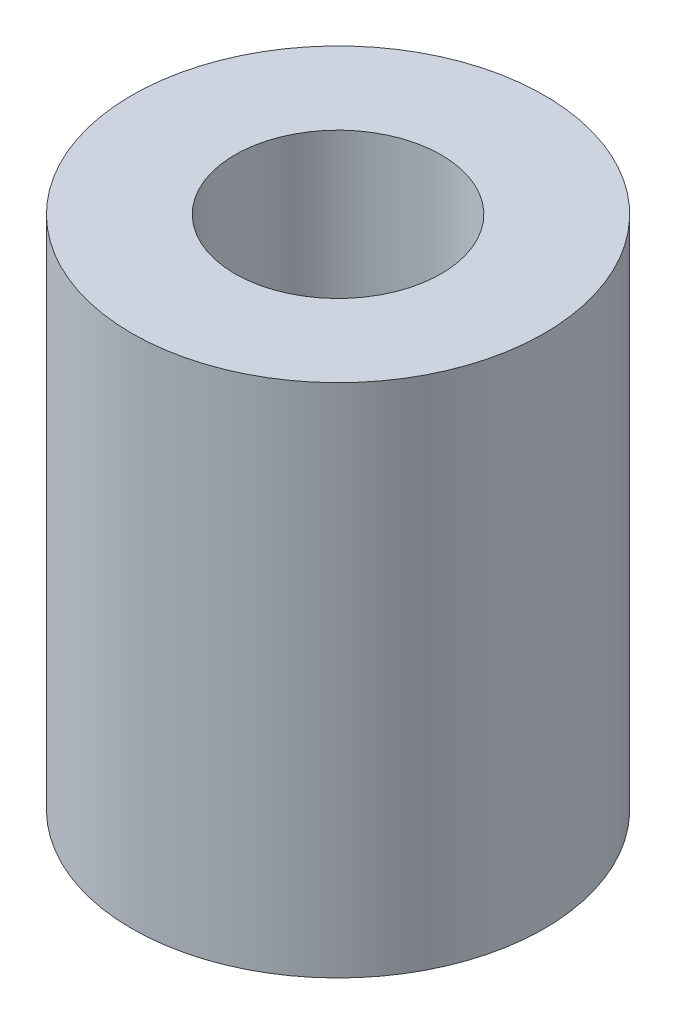
ISO-10303-21;
HEADER;
FILE_DESCRIPTION(('STEP AP214'),'2;1');
FILE_NAME('part.step','',(''),(''),'','','');
FILE_SCHEMA(('AUTOMOTIVE_DESIGN { 1 0 10303 214 1 1 1 1 }'));
ENDSEC;
DATA;
#1=APPLICATION_CONTEXT('core data for automotive mechanical design processes');
#2=APPLICATION_PROTOCOL_DEFINITION('international standard','automotive_design',2000,#1);
#3=PRODUCT_CONTEXT('',#1,'mechanical');
#4=PRODUCT('Part','Part','',(#3));
#5=PRODUCT_RELATED_PRODUCT_CATEGORY('part','',(#4));
#6=PRODUCT_DEFINITION_FORMATION('','',#4);
#7=PRODUCT_DEFINITION_CONTEXT('part definition',#1,'design');
#8=PRODUCT_DEFINITION('design','',#6,#7);
#9=PRODUCT_DEFINITION_SHAPE('','',#8);
#10=(LENGTH_UNIT() NAMED_UNIT(*) SI_UNIT(.MILLI.,.METRE.));
#11=(NAMED_UNIT(*) PLANE_ANGLE_UNIT() SI_UNIT($,.RADIAN.));
#12=(NAMED_UNIT(*) SI_UNIT($,.STERADIAN.) SOLID_ANGLE_UNIT());
#13=UNCERTAINTY_MEASURE_WITH_UNIT(LENGTH_MEASURE(1.E-05),#10,'distance_accuracy_value','');
#14=(GEOMETRIC_REPRESENTATION_CONTEXT(3) GLOBAL_UNCERTAINTY_ASSIGNED_CONTEXT((#13)) GLOBAL_UNIT_ASSIGNED_CONTEXT((#10,
#11,#12)) REPRESENTATION_CONTEXT('',''));
#15=CARTESIAN_POINT('',(0.,0.,0.));
#16=DIRECTION('',(0.,0.,1.));
#17=DIRECTION('',(1.,0.,0.));
#18=AXIS2_PLACEMENT_3D('',#15,#16,#17);
#19=CARTESIAN_POINT('',(0.,12.5,0.));
#20=DIRECTION('',(0.,1.,0.));
#21=DIRECTION('',(0.,0.,1.));
#22=AXIS2_PLACEMENT_3D('',#19,#20,#21);
#23=PLANE('',#22);
#24=CARTESIAN_POINT('',(0.,12.5,0.));
#25=DIRECTION('',(0.,1.,0.));
#26=DIRECTION('',(0.,0.,1.));
#27=AXIS2_PLACEMENT_3D('',#24,#25,#26);
#28=CIRCLE('',#27,10.);
#29=CARTESIAN_POINT('',(0.,12.5,10.));
#30=VERTEX_POINT('',#29);
#31=EDGE_CURVE('E10',#30,#30,#28,.T.);
#32=ORIENTED_EDGE('',*,*,#31,.T.);
#33=EDGE_LOOP('',(#32));
#34=FACE_BOUND('',#33,.T.);
#35=CARTESIAN_POINT('',(0.,12.5,0.));
#36=DIRECTION('',(0.,1.,0.));
#37=DIRECTION('',(0.,0.,1.));
#38=AXIS2_PLACEMENT_3D('',#35,#36,#37);
#39=CIRCLE('',#38,5.);
#40=CARTESIAN_POINT('',(0.,12.5,5.));
#41=VERTEX_POINT('',#40);
#42=EDGE_CURVE('E48',#41,#41,#39,.T.);
#43=ORIENTED_EDGE('',*,*,#42,.F.);
#44=EDGE_LOOP('',(#43));
#45=FACE_BOUND('',#44,.T.);
#46=ADVANCED_FACE('F37',(#34,#45),#23,.T.);
#47=CARTESIAN_POINT('',(0.,-12.5,0.));
#48=DIRECTION('',(0.,1.,0.));
#49=DIRECTION('',(0.,0.,1.));
#50=AXIS2_PLACEMENT_3D('',#47,#48,#49);
#51=PLANE('',#50);
#52=CARTESIAN_POINT('',(0.,-12.5,0.));
#53=DIRECTION('',(0.,1.,0.));
#54=DIRECTION('',(0.,0.,1.));
#55=AXIS2_PLACEMENT_3D('',#52,#53,#54);
#56=CIRCLE('',#55,10.);
#57=CARTESIAN_POINT('',(0.,-12.5,10.));
#58=VERTEX_POINT('',#57);
#59=EDGE_CURVE('E41',#58,#58,#56,.T.);
#60=ORIENTED_EDGE('',*,*,#59,.F.);
#61=EDGE_LOOP('',(#60));
#62=FACE_BOUND('',#61,.T.);
#63=CARTESIAN_POINT('',(0.,-12.5,0.));
#64=DIRECTION('',(0.,1.,0.));
#65=DIRECTION('',(0.,0.,1.));
#66=AXIS2_PLACEMENT_3D('',#63,#64,#65);
#67=CIRCLE('',#66,5.);
#68=CARTESIAN_POINT('',(0.,-12.5,5.));
#69=VERTEX_POINT('',#68);
#70=EDGE_CURVE('E50',#69,#69,#67,.T.);
#71=ORIENTED_EDGE('',*,*,#70,.T.);
#72=EDGE_LOOP('',(#71));
#73=FACE_BOUND('',#72,.T.);
#74=ADVANCED_FACE('F60',(#62,#73),#51,.F.);
#75=CARTESIAN_POINT('',(0.,12.5,0.));
#76=DIRECTION('',(0.,-1.,0.));
#77=DIRECTION('',(0.,0.,-1.));
#78=AXIS2_PLACEMENT_3D('',#75,#76,#77);
#79=CYLINDRICAL_SURFACE('',#78,10.);
#80=ORIENTED_EDGE('',*,*,#31,.F.);
#81=EDGE_LOOP('',(#80));
#82=FACE_BOUND('',#81,.T.);
#83=ORIENTED_EDGE('',*,*,#59,.T.);
#84=EDGE_LOOP('',(#83));
#85=FACE_BOUND('',#84,.T.);
#86=ADVANCED_FACE('F39',(#82,#85),#79,.T.);
#87=CARTESIAN_POINT('',(0.,12.5,0.));
#88=DIRECTION('',(0.,-1.,0.));
#89=DIRECTION('',(0.,0.,-1.));
#90=AXIS2_PLACEMENT_3D('',#87,#88,#89);
#91=CYLINDRICAL_SURFACE('',#90,5.);
#92=ORIENTED_EDGE('',*,*,#42,.T.);
#93=EDGE_LOOP('',(#92));
#94=FACE_BOUND('',#93,.T.);
#95=ORIENTED_EDGE('',*,*,#70,.F.);
#96=EDGE_LOOP('',(#95));
#97=FACE_BOUND('',#96,.T.);
#98=ADVANCED_FACE('F56',(#94,#97),#91,.F.);
#99=CLOSED_SHELL('',(#46,#74,#86,#98));
#100=MANIFOLD_SOLID_BREP('B2',#99);
#101=ADVANCED_BREP_SHAPE_REPRESENTATION('',(#18,#100),#14);
#102=SHAPE_DEFINITION_REPRESENTATION(#9,#101);
ENDSEC;
END-ISO-10303-21;
